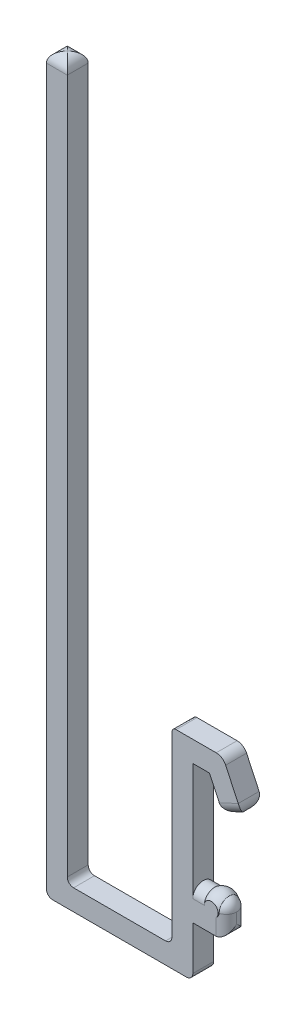
ISO-10303-21;
HEADER;
FILE_DESCRIPTION(('STEP AP214'),'2;1');
FILE_NAME('part.step','',(''),(''),'','','');
FILE_SCHEMA(('AUTOMOTIVE_DESIGN { 1 0 10303 214 1 1 1 1 }'));
ENDSEC;
DATA;
#1=APPLICATION_CONTEXT('core data for automotive mechanical design processes');
#2=APPLICATION_PROTOCOL_DEFINITION('international standard','automotive_design',2000,#1);
#3=PRODUCT_CONTEXT('',#1,'mechanical');
#4=PRODUCT('Part','Part','',(#3));
#5=PRODUCT_RELATED_PRODUCT_CATEGORY('part','',(#4));
#6=PRODUCT_DEFINITION_FORMATION('','',#4);
#7=PRODUCT_DEFINITION_CONTEXT('part definition',#1,'design');
#8=PRODUCT_DEFINITION('design','',#6,#7);
#9=PRODUCT_DEFINITION_SHAPE('','',#8);
#10=(LENGTH_UNIT() NAMED_UNIT(*) SI_UNIT(.MILLI.,.METRE.));
#11=(NAMED_UNIT(*) PLANE_ANGLE_UNIT() SI_UNIT($,.RADIAN.));
#12=(NAMED_UNIT(*) SI_UNIT($,.STERADIAN.) SOLID_ANGLE_UNIT());
#13=UNCERTAINTY_MEASURE_WITH_UNIT(LENGTH_MEASURE(1.E-05),#10,'distance_accuracy_value','');
#14=(GEOMETRIC_REPRESENTATION_CONTEXT(3) GLOBAL_UNCERTAINTY_ASSIGNED_CONTEXT((#13)) GLOBAL_UNIT_ASSIGNED_CONTEXT((#10,
#11,#12)) REPRESENTATION_CONTEXT('',''));
#15=CARTESIAN_POINT('',(0.,0.,0.));
#16=DIRECTION('',(0.,0.,1.));
#17=DIRECTION('',(1.,0.,0.));
#18=AXIS2_PLACEMENT_3D('',#15,#16,#17);
#19=CARTESIAN_POINT('',(13.5901699437495,0.,2.5));
#20=DIRECTION('',(-1.,0.,0.));
#21=DIRECTION('',(0.,0.,1.));
#22=AXIS2_PLACEMENT_3D('',#19,#20,#21);
#23=CYLINDRICAL_SURFACE('',#22,2.5);
#24=CARTESIAN_POINT('',(2.7416876048223,0.,2.5));
#25=DIRECTION('',(1.,0.,0.));
#26=DIRECTION('',(0.,0.,-1.));
#27=AXIS2_PLACEMENT_3D('',#24,#25,#26);
#28=CIRCLE('',#27,2.5);
#29=CARTESIAN_POINT('',(2.7416876048223,0.,0.));
#30=VERTEX_POINT('',#29);
#31=CARTESIAN_POINT('',(2.7416876048223,0.,5.));
#32=VERTEX_POINT('',#31);
#33=EDGE_CURVE('E236',#30,#32,#28,.T.);
#34=ORIENTED_EDGE('',*,*,#33,.F.);
#35=DIRECTION('',(-1.,0.,0.));
#36=VECTOR('',#35,1.);
#37=CARTESIAN_POINT('',(0.,0.,0.));
#38=LINE('',#37,#36);
#39=CARTESIAN_POINT('',(0.,0.,0.));
#40=VERTEX_POINT('',#39);
#41=EDGE_CURVE('E311',#30,#40,#38,.T.);
#42=ORIENTED_EDGE('',*,*,#41,.T.);
#43=CARTESIAN_POINT('',(0.,0.,2.5));
#44=DIRECTION('',(1.,0.,0.));
#45=DIRECTION('',(0.,0.,-1.));
#46=AXIS2_PLACEMENT_3D('',#43,#44,#45);
#47=CIRCLE('',#46,2.5);
#48=CARTESIAN_POINT('',(0.,0.,5.));
#49=VERTEX_POINT('',#48);
#50=EDGE_CURVE('E441',#40,#49,#47,.T.);
#51=ORIENTED_EDGE('',*,*,#50,.T.);
#52=DIRECTION('',(-1.,0.,0.));
#53=VECTOR('',#52,1.);
#54=CARTESIAN_POINT('',(0.,0.,5.));
#55=LINE('',#54,#53);
#56=EDGE_CURVE('E313',#32,#49,#55,.T.);
#57=ORIENTED_EDGE('',*,*,#56,.F.);
#58=EDGE_LOOP('',(#34,#42,#51,#57));
#59=FACE_BOUND('',#58,.T.);
#60=ADVANCED_FACE('F39',(#59),#23,.T.);
#61=CARTESIAN_POINT('',(5.5,0.,2.5));
#62=DIRECTION('',(0.,-1.,0.));
#63=DIRECTION('',(0.,0.,-1.));
#64=AXIS2_PLACEMENT_3D('',#61,#62,#63);
#65=CYLINDRICAL_SURFACE('',#64,2.5);
#66=DIRECTION('',(0.,1.,0.));
#67=VECTOR('',#66,1.);
#68=CARTESIAN_POINT('',(5.5,-5.,0.));
#69=LINE('',#68,#67);
#70=CARTESIAN_POINT('',(5.5,-1.24096736459909,0.));
#71=VERTEX_POINT('',#70);
#72=CARTESIAN_POINT('',(5.5,-5.,0.));
#73=VERTEX_POINT('',#72);
#74=EDGE_CURVE('E227',#71,#73,#69,.F.);
#75=ORIENTED_EDGE('',*,*,#74,.F.);
#76=CARTESIAN_POINT('',(5.4998,-1.24114463299005,8.00000016901504E-09));
#77=CARTESIAN_POINT('',(5.5363929673262,-1.2087029649529,-9.26164938524013E-06));
#78=CARTESIAN_POINT('',(5.57236876038989,-1.17555626849876,0.00079770122016531));
#79=CARTESIAN_POINT('',(5.6428030561148,-1.10769667819631,0.00383433659862395));
#80=CARTESIAN_POINT('',(5.67726031215857,-1.07298254322827,0.0060651555671746));
#81=CARTESIAN_POINT('',(5.74519128912905,-1.00095424317269,0.0118132669352872));
#82=CARTESIAN_POINT('',(5.77861573042543,-0.963595826296857,0.0153626740978217));
#83=CARTESIAN_POINT('',(5.84305795009588,-0.886981329738944,0.0234356736079334));
#84=CARTESIAN_POINT('',(5.8740762229525,-0.847725642663384,0.0279590650703918));
#85=CARTESIAN_POINT('',(5.96325201148396,-0.726269508254624,0.042561851108955));
#86=CARTESIAN_POINT('',(6.01705538420124,-0.640865596374251,0.0536260746175859));
#87=CARTESIAN_POINT('',(6.10655009460944,-0.461922147892546,0.074258393974845));
#88=CARTESIAN_POINT('',(6.14249859084772,-0.368522297372846,0.0838462716282918));
#89=CARTESIAN_POINT('',(6.17730370336194,-0.227795718404401,0.0934686773099391));
#90=CARTESIAN_POINT('',(6.18570287472368,-0.1829602446012,0.0958641595546958));
#91=CARTESIAN_POINT('',(6.19710907659667,-0.0920455434275466,0.0991560697495525));
#92=CARTESIAN_POINT('',(6.20005395659277,-0.0459579806521387,0.100035211650277));
#93=CARTESIAN_POINT('',(6.19999998181818,0.000200000000000188,0.0999999946969703));
#94=B_SPLINE_CURVE_WITH_KNOTS('',3,(#76,#77,#78,#79,#80,#81,#82,#83,#84,#85,#86,#87,#88,#89,#90,
#91,#92,#93),.UNSPECIFIED.,.F.,.F.,(4,2,2,2,2,2,2,2,4),(0.,0.146701218214616,0.29352070649968,
0.444179394748281,0.594807039223552,0.898088830284032,1.196865790681,1.3335683412279,
1.47181922641049),.UNSPECIFIED.);
#95=CARTESIAN_POINT('',(6.2,0.,0.100000000000001));
#96=VERTEX_POINT('',#95);
#97=EDGE_CURVE('E272',#71,#96,#94,.T.);
#98=ORIENTED_EDGE('',*,*,#97,.T.);
#99=CARTESIAN_POINT('',(5.5,0.,2.5));
#100=DIRECTION('',(0.,1.,0.));
#101=DIRECTION('',(0.,0.,1.));
#102=AXIS2_PLACEMENT_3D('',#99,#100,#101);
#103=CIRCLE('',#102,2.5);
#104=CARTESIAN_POINT('',(8.,0.,2.5));
#105=VERTEX_POINT('',#104);
#106=EDGE_CURVE('E472',#105,#96,#103,.T.);
#107=ORIENTED_EDGE('',*,*,#106,.F.);
#108=DIRECTION('',(0.,1.,0.));
#109=VECTOR('',#108,1.);
#110=CARTESIAN_POINT('',(8.,0.,2.5));
#111=LINE('',#110,#109);
#112=CARTESIAN_POINT('',(8.,-2.5,2.5));
#113=VERTEX_POINT('',#112);
#114=EDGE_CURVE('E470',#113,#105,#111,.T.);
#115=ORIENTED_EDGE('',*,*,#114,.F.);
#116=CARTESIAN_POINT('',(5.5,-2.5,2.5));
#117=DIRECTION('',(0.,0.707106781186547,-0.707106781186547));
#118=DIRECTION('',(0.,-0.707106781186547,-0.707106781186547));
#119=AXIS2_PLACEMENT_3D('',#116,#117,#118);
#120=ELLIPSE('',#119,3.53553390593274,2.5);
#121=EDGE_CURVE('E258',#73,#113,#120,.F.);
#122=ORIENTED_EDGE('',*,*,#121,.F.);
#123=EDGE_LOOP('',(#75,#98,#107,#115,#122));
#124=FACE_BOUND('',#123,.T.);
#125=ADVANCED_FACE('F284',(#124),#65,.T.);
#126=CARTESIAN_POINT('',(5.5,0.,2.5));
#127=DIRECTION('',(-1.,0.,0.));
#128=DIRECTION('',(0.,0.,1.));
#129=AXIS2_PLACEMENT_3D('',#126,#127,#128);
#130=SPHERICAL_SURFACE('',#129,2.5);
#131=ORIENTED_EDGE('',*,*,#106,.T.);
#132=CARTESIAN_POINT('',(6.2,0.,2.5));
#133=DIRECTION('',(-1.,0.,0.));
#134=DIRECTION('',(0.,0.,1.));
#135=AXIS2_PLACEMENT_3D('',#132,#133,#134);
#136=CIRCLE('',#135,2.4);
#137=CARTESIAN_POINT('',(6.2,0.,4.9));
#138=VERTEX_POINT('',#137);
#139=EDGE_CURVE('E282',#96,#138,#136,.F.);
#140=ORIENTED_EDGE('',*,*,#139,.T.);
#141=CARTESIAN_POINT('',(5.5,0.,2.5));
#142=DIRECTION('',(0.,-1.,0.));
#143=DIRECTION('',(0.,0.,-1.));
#144=AXIS2_PLACEMENT_3D('',#141,#142,#143);
#145=CIRCLE('',#144,2.5);
#146=EDGE_CURVE('E245',#105,#138,#145,.T.);
#147=ORIENTED_EDGE('',*,*,#146,.F.);
#148=EDGE_LOOP('',(#131,#140,#147));
#149=FACE_BOUND('',#148,.T.);
#150=ADVANCED_FACE('F289',(#149),#130,.T.);
#151=CARTESIAN_POINT('',(5.5,0.,2.5));
#152=DIRECTION('',(0.,1.,0.));
#153=DIRECTION('',(0.,0.,1.));
#154=AXIS2_PLACEMENT_3D('',#151,#152,#153);
#155=CYLINDRICAL_SURFACE('',#154,2.5);
#156=ORIENTED_EDGE('',*,*,#146,.T.);
#157=CARTESIAN_POINT('',(6.19999998181818,0.0002,4.90000000530303));
#158=CARTESIAN_POINT('',(6.20002060593483,-0.0340215820751625,4.8999881731683));
#159=CARTESIAN_POINT('',(6.1984143593459,-0.0682209096207422,4.90046286433432));
#160=CARTESIAN_POINT('',(6.19208379810463,-0.136249463080852,4.90229830533756));
#161=CARTESIAN_POINT('',(6.18736474729119,-0.170079215952131,4.90365755930238));
#162=CARTESIAN_POINT('',(6.1689482938362,-0.269536910764676,4.90887369332737));
#163=CARTESIAN_POINT('',(6.15098131886339,-0.334336983187606,4.91387497360715));
#164=CARTESIAN_POINT('',(6.09808868579219,-0.480851170246759,4.92759913373652));
#165=CARTESIAN_POINT('',(6.05953499991633,-0.561148858343043,4.9370045157109));
#166=CARTESIAN_POINT('',(5.97007827325949,-0.715449277029459,4.95583685420229));
#167=CARTESIAN_POINT('',(5.91904380010561,-0.789372868652353,4.96526290588241));
#168=CARTESIAN_POINT('',(5.80922506209963,-0.929818254648964,4.98141526656959));
#169=CARTESIAN_POINT('',(5.75055545651682,-0.996426935956446,4.98817650123594));
#170=CARTESIAN_POINT('',(5.65870838300495,-1.09170672728009,4.99514321976577));
#171=CARTESIAN_POINT('',(5.62774086496115,-1.12244386881611,4.99693401300135));
#172=CARTESIAN_POINT('',(5.56461568283012,-1.1826876244331,4.99936451304459));
#173=CARTESIAN_POINT('',(5.5324586096933,-1.21219483443042,5.00000478377816));
#174=CARTESIAN_POINT('',(5.4998,-1.24114463299005,4.999999992));
#175=B_SPLINE_CURVE_WITH_KNOTS('',3,(#157,#158,#159,#160,#161,#162,#163,#164,#165,#166,#167,
#168,#169,#170,#171,#172,#173,#174),.UNSPECIFIED.,.F.,.F.,(4,2,2,2,2,2,2,2,4),(0.,
0.102583403755103,0.204993779301411,0.406260766109181,0.673486519863846,0.943657669752398,
1.21015973265302,1.34112701736425,1.47203009124063),.UNSPECIFIED.);
#176=CARTESIAN_POINT('',(5.5,-1.24096736459909,5.));
#177=VERTEX_POINT('',#176);
#178=EDGE_CURVE('E233',#138,#177,#175,.T.);
#179=ORIENTED_EDGE('',*,*,#178,.T.);
#180=DIRECTION('',(0.,1.,0.));
#181=VECTOR('',#180,1.);
#182=CARTESIAN_POINT('',(5.5,0.,5.));
#183=LINE('',#182,#181);
#184=CARTESIAN_POINT('',(5.5,-5.,5.));
#185=VERTEX_POINT('',#184);
#186=EDGE_CURVE('E215',#185,#177,#183,.T.);
#187=ORIENTED_EDGE('',*,*,#186,.F.);
#188=CARTESIAN_POINT('',(5.5,-2.5,2.5));
#189=DIRECTION('',(0.,-0.707106781186547,-0.707106781186547));
#190=DIRECTION('',(0.,0.707106781186547,-0.707106781186547));
#191=AXIS2_PLACEMENT_3D('',#188,#189,#190);
#192=ELLIPSE('',#191,3.53553390593274,2.5);
#193=EDGE_CURVE('E467',#185,#113,#192,.F.);
#194=ORIENTED_EDGE('',*,*,#193,.T.);
#195=ORIENTED_EDGE('',*,*,#114,.T.);
#196=EDGE_LOOP('',(#156,#179,#187,#194,#195));
#197=FACE_BOUND('',#196,.T.);
#198=ADVANCED_FACE('F242',(#197),#155,.T.);
#199=CARTESIAN_POINT('',(0.,0.,5.));
#200=DIRECTION('',(-1.,0.,0.));
#201=DIRECTION('',(0.,0.,1.));
#202=AXIS2_PLACEMENT_3D('',#199,#200,#201);
#203=PLANE('',#202);
#204=ORIENTED_EDGE('',*,*,#50,.F.);
#205=DIRECTION('',(0.,1.,0.));
#206=VECTOR('',#205,1.);
#207=CARTESIAN_POINT('',(0.,0.,0.));
#208=LINE('',#207,#206);
#209=CARTESIAN_POINT('',(0.,28.,0.));
#210=VERTEX_POINT('',#209);
#211=EDGE_CURVE('E319',#40,#210,#208,.T.);
#212=ORIENTED_EDGE('',*,*,#211,.T.);
#213=DIRECTION('',(0.,0.,-1.));
#214=VECTOR('',#213,1.);
#215=CARTESIAN_POINT('',(0.,28.,5.));
#216=LINE('',#215,#214);
#217=CARTESIAN_POINT('',(0.,28.,5.));
#218=VERTEX_POINT('',#217);
#219=EDGE_CURVE('E380',#218,#210,#216,.T.);
#220=ORIENTED_EDGE('',*,*,#219,.F.);
#221=DIRECTION('',(0.,1.,0.));
#222=VECTOR('',#221,1.);
#223=CARTESIAN_POINT('',(0.,0.,5.));
#224=LINE('',#223,#222);
#225=EDGE_CURVE('E485',#49,#218,#224,.T.);
#226=ORIENTED_EDGE('',*,*,#225,.F.);
#227=EDGE_LOOP('',(#204,#212,#220,#226));
#228=FACE_BOUND('',#227,.T.);
#229=ADVANCED_FACE('F677',(#228),#203,.F.);
#230=CARTESIAN_POINT('',(0.,28.,5.));
#231=DIRECTION('',(0.,1.,0.));
#232=DIRECTION('',(0.,0.,1.));
#233=AXIS2_PLACEMENT_3D('',#230,#231,#232);
#234=PLANE('',#233);
#235=DIRECTION('',(1.,0.,0.));
#236=VECTOR('',#235,1.);
#237=CARTESIAN_POINT('',(0.,28.,0.));
#238=LINE('',#237,#236);
#239=CARTESIAN_POINT('',(4.,28.,0.));
#240=VERTEX_POINT('',#239);
#241=EDGE_CURVE('E326',#210,#240,#238,.T.);
#242=ORIENTED_EDGE('',*,*,#241,.T.);
#243=DIRECTION('',(0.,0.,-1.));
#244=VECTOR('',#243,1.);
#245=CARTESIAN_POINT('',(4.,28.,5.));
#246=LINE('',#245,#244);
#247=CARTESIAN_POINT('',(4.,28.,5.));
#248=VERTEX_POINT('',#247);
#249=EDGE_CURVE('E376',#248,#240,#246,.T.);
#250=ORIENTED_EDGE('',*,*,#249,.F.);
#251=DIRECTION('',(1.,0.,0.));
#252=VECTOR('',#251,1.);
#253=CARTESIAN_POINT('',(0.,28.,5.));
#254=LINE('',#253,#252);
#255=EDGE_CURVE('E488',#218,#248,#254,.T.);
#256=ORIENTED_EDGE('',*,*,#255,.F.);
#257=ORIENTED_EDGE('',*,*,#219,.T.);
#258=EDGE_LOOP('',(#242,#250,#256,#257));
#259=FACE_BOUND('',#258,.T.);
#260=ADVANCED_FACE('F673',(#259),#234,.F.);
#261=CARTESIAN_POINT('',(4.,28.,5.));
#262=DIRECTION('',(0.906307787036651,0.422618261740697,0.));
#263=DIRECTION('',(-0.422618261740697,0.906307787036651,0.));
#264=AXIS2_PLACEMENT_3D('',#261,#262,#263);
#265=PLANE('',#264);
#266=DIRECTION('',(0.422618261740697,-0.906307787036651,0.));
#267=VECTOR('',#266,1.);
#268=CARTESIAN_POINT('',(4.,28.,0.));
#269=LINE('',#268,#267);
#270=CARTESIAN_POINT('',(6.32440043957384,23.0153071712984,0.));
#271=VERTEX_POINT('',#270);
#272=EDGE_CURVE('E336',#240,#271,#269,.T.);
#273=ORIENTED_EDGE('',*,*,#272,.T.);
#274=DIRECTION('',(0.,0.,-1.));
#275=VECTOR('',#274,1.);
#276=CARTESIAN_POINT('',(6.32440043957383,23.0153071712984,5.));
#277=LINE('',#276,#275);
#278=CARTESIAN_POINT('',(6.32440043957384,23.0153071712984,5.));
#279=VERTEX_POINT('',#278);
#280=EDGE_CURVE('E384',#271,#279,#277,.F.);
#281=ORIENTED_EDGE('',*,*,#280,.T.);
#282=DIRECTION('',(0.422618261740697,-0.906307787036651,0.));
#283=VECTOR('',#282,1.);
#284=CARTESIAN_POINT('',(4.,28.,5.));
#285=LINE('',#284,#283);
#286=EDGE_CURVE('E491',#248,#279,#285,.T.);
#287=ORIENTED_EDGE('',*,*,#286,.F.);
#288=ORIENTED_EDGE('',*,*,#249,.T.);
#289=EDGE_LOOP('',(#273,#281,#287,#288));
#290=FACE_BOUND('',#289,.T.);
#291=ADVANCED_FACE('F668',(#290),#265,.F.);
#292=CARTESIAN_POINT('',(11.9124850291088,22.8626290124103,5.));
#293=DIRECTION('',(-0.906307787036651,-0.422618261740697,0.));
#294=DIRECTION('',(0.422618261740697,-0.906307787036651,0.));
#295=AXIS2_PLACEMENT_3D('',#292,#293,#294);
#296=PLANE('',#295);
#297=DIRECTION('',(-0.422618261740697,0.906307787036651,0.));
#298=VECTOR('',#297,1.);
#299=CARTESIAN_POINT('',(11.9124850291088,22.8626290124103,5.));
#300=LINE('',#299,#298);
#301=CARTESIAN_POINT('',(10.8559393747571,25.1283984800019,5.));
#302=VERTEX_POINT('',#301);
#303=CARTESIAN_POINT('',(7.85844511961037,31.5565456543517,5.));
#304=VERTEX_POINT('',#303);
#305=EDGE_CURVE('E495',#302,#304,#300,.T.);
#306=ORIENTED_EDGE('',*,*,#305,.F.);
#307=DIRECTION('',(0.,0.,-1.));
#308=VECTOR('',#307,1.);
#309=CARTESIAN_POINT('',(10.8559393747571,25.1283984800019,5.));
#310=LINE('',#309,#308);
#311=CARTESIAN_POINT('',(10.8559393747571,25.1283984800019,0.));
#312=VERTEX_POINT('',#311);
#313=EDGE_CURVE('E400',#302,#312,#310,.T.);
#314=ORIENTED_EDGE('',*,*,#313,.T.);
#315=DIRECTION('',(-0.422618261740697,0.906307787036651,0.));
#316=VECTOR('',#315,1.);
#317=CARTESIAN_POINT('',(11.9124850291088,22.8626290124103,0.));
#318=LINE('',#317,#316);
#319=CARTESIAN_POINT('',(7.85844511961037,31.5565456543517,0.));
#320=VERTEX_POINT('',#319);
#321=EDGE_CURVE('E340',#312,#320,#318,.T.);
#322=ORIENTED_EDGE('',*,*,#321,.T.);
#323=DIRECTION('',(0.,0.,-1.));
#324=VECTOR('',#323,1.);
#325=CARTESIAN_POINT('',(7.85844511961037,31.5565456543517,5.));
#326=LINE('',#325,#324);
#327=EDGE_CURVE('E397',#320,#304,#326,.F.);
#328=ORIENTED_EDGE('',*,*,#327,.T.);
#329=EDGE_LOOP('',(#306,#314,#322,#328));
#330=FACE_BOUND('',#329,.T.);
#331=ADVANCED_FACE('F654',(#330),#296,.F.);
#332=CARTESIAN_POINT('',(-5.,33.,5.));
#333=DIRECTION('',(0.,-1.,0.));
#334=DIRECTION('',(0.,0.,-1.));
#335=AXIS2_PLACEMENT_3D('',#332,#333,#334);
#336=PLANE('',#335);
#337=DIRECTION('',(-1.,0.,0.));
#338=VECTOR('',#337,1.);
#339=CARTESIAN_POINT('',(-5.,33.,0.));
#340=LINE('',#339,#338);
#341=CARTESIAN_POINT('',(5.59267565201873,33.,0.));
#342=VERTEX_POINT('',#341);
#343=CARTESIAN_POINT('',(-4.,33.,0.));
#344=VERTEX_POINT('',#343);
#345=EDGE_CURVE('E344',#342,#344,#340,.T.);
#346=ORIENTED_EDGE('',*,*,#345,.T.);
#347=DIRECTION('',(0.,0.,-1.));
#348=VECTOR('',#347,1.);
#349=CARTESIAN_POINT('',(-4.,33.,5.));
#350=LINE('',#349,#348);
#351=CARTESIAN_POINT('',(-4.,33.,5.));
#352=VERTEX_POINT('',#351);
#353=EDGE_CURVE('E458',#344,#352,#350,.F.);
#354=ORIENTED_EDGE('',*,*,#353,.T.);
#355=DIRECTION('',(-1.,0.,0.));
#356=VECTOR('',#355,1.);
#357=CARTESIAN_POINT('',(-5.,33.,5.));
#358=LINE('',#357,#356);
#359=CARTESIAN_POINT('',(5.59267565201873,33.,5.));
#360=VERTEX_POINT('',#359);
#361=EDGE_CURVE('E499',#360,#352,#358,.T.);
#362=ORIENTED_EDGE('',*,*,#361,.F.);
#363=DIRECTION('',(0.,0.,-1.));
#364=VECTOR('',#363,1.);
#365=CARTESIAN_POINT('',(5.59267565201874,33.,5.));
#366=LINE('',#365,#364);
#367=EDGE_CURVE('E420',#360,#342,#366,.T.);
#368=ORIENTED_EDGE('',*,*,#367,.T.);
#369=EDGE_LOOP('',(#346,#354,#362,#368));
#370=FACE_BOUND('',#369,.T.);
#371=ADVANCED_FACE('F646',(#370),#336,.F.);
#372=CARTESIAN_POINT('',(-5.,33.,5.));
#373=DIRECTION('',(1.,0.,0.));
#374=DIRECTION('',(0.,1.,0.));
#375=AXIS2_PLACEMENT_3D('',#372,#373,#374);
#376=PLANE('',#375);
#377=DIRECTION('',(0.,-1.,0.));
#378=VECTOR('',#377,1.);
#379=CARTESIAN_POINT('',(-5.,33.,0.));
#380=LINE('',#379,#378);
#381=CARTESIAN_POINT('',(-5.,32.,0.));
#382=VERTEX_POINT('',#381);
#383=CARTESIAN_POINT('',(-4.99999999999999,-10.5,0.));
#384=VERTEX_POINT('',#383);
#385=EDGE_CURVE('E348',#382,#384,#380,.T.);
#386=ORIENTED_EDGE('',*,*,#385,.T.);
#387=DIRECTION('',(0.,0.,-1.));
#388=VECTOR('',#387,1.);
#389=CARTESIAN_POINT('',(-4.99999999999999,-10.5,5.));
#390=LINE('',#389,#388);
#391=CARTESIAN_POINT('',(-4.99999999999999,-10.5,5.));
#392=VERTEX_POINT('',#391);
#393=EDGE_CURVE('E572',#384,#392,#390,.F.);
#394=ORIENTED_EDGE('',*,*,#393,.T.);
#395=DIRECTION('',(0.,-1.,0.));
#396=VECTOR('',#395,1.);
#397=CARTESIAN_POINT('',(-5.,33.,5.));
#398=LINE('',#397,#396);
#399=CARTESIAN_POINT('',(-5.,32.,5.));
#400=VERTEX_POINT('',#399);
#401=EDGE_CURVE('E503',#400,#392,#398,.T.);
#402=ORIENTED_EDGE('',*,*,#401,.F.);
#403=DIRECTION('',(0.,0.,-1.));
#404=VECTOR('',#403,1.);
#405=CARTESIAN_POINT('',(-5.,32.,5.));
#406=LINE('',#405,#404);
#407=EDGE_CURVE('E424',#400,#382,#406,.T.);
#408=ORIENTED_EDGE('',*,*,#407,.T.);
#409=EDGE_LOOP('',(#386,#394,#402,#408));
#410=FACE_BOUND('',#409,.T.);
#411=ADVANCED_FACE('F641',(#410),#376,.F.);
#412=CARTESIAN_POINT('',(-30.,-12.,5.));
#413=DIRECTION('',(0.,-1.,0.));
#414=DIRECTION('',(0.,0.,-1.));
#415=AXIS2_PLACEMENT_3D('',#412,#413,#414);
#416=PLANE('',#415);
#417=DIRECTION('',(-1.,0.,0.));
#418=VECTOR('',#417,1.);
#419=CARTESIAN_POINT('',(-30.,-12.,5.));
#420=LINE('',#419,#418);
#421=CARTESIAN_POINT('',(-6.5,-12.,5.));
#422=VERTEX_POINT('',#421);
#423=CARTESIAN_POINT('',(-28.5,-12.,5.));
#424=VERTEX_POINT('',#423);
#425=EDGE_CURVE('E507',#422,#424,#420,.T.);
#426=ORIENTED_EDGE('',*,*,#425,.F.);
#427=DIRECTION('',(0.,0.,-1.));
#428=VECTOR('',#427,1.);
#429=CARTESIAN_POINT('',(-6.5,-12.,0.));
#430=LINE('',#429,#428);
#431=CARTESIAN_POINT('',(-6.5,-12.,0.));
#432=VERTEX_POINT('',#431);
#433=EDGE_CURVE('E575',#422,#432,#430,.T.);
#434=ORIENTED_EDGE('',*,*,#433,.T.);
#435=DIRECTION('',(-1.,0.,0.));
#436=VECTOR('',#435,1.);
#437=CARTESIAN_POINT('',(-30.,-12.,0.));
#438=LINE('',#437,#436);
#439=CARTESIAN_POINT('',(-28.5,-12.,0.));
#440=VERTEX_POINT('',#439);
#441=EDGE_CURVE('E352',#432,#440,#438,.T.);
#442=ORIENTED_EDGE('',*,*,#441,.T.);
#443=DIRECTION('',(0.,0.,-1.));
#444=VECTOR('',#443,1.);
#445=CARTESIAN_POINT('',(-28.5,-12.,5.));
#446=LINE('',#445,#444);
#447=EDGE_CURVE('E579',#440,#424,#446,.F.);
#448=ORIENTED_EDGE('',*,*,#447,.T.);
#449=EDGE_LOOP('',(#426,#434,#442,#448));
#450=FACE_BOUND('',#449,.T.);
#451=ADVANCED_FACE('F585',(#450),#416,.F.);
#452=CARTESIAN_POINT('',(-30.,-12.,5.));
#453=DIRECTION('',(-1.,0.,0.));
#454=DIRECTION('',(0.,-1.,0.));
#455=AXIS2_PLACEMENT_3D('',#452,#453,#454);
#456=PLANE('',#455);
#457=DIRECTION('',(0.,1.,0.));
#458=VECTOR('',#457,1.);
#459=CARTESIAN_POINT('',(-30.,-12.,5.));
#460=LINE('',#459,#458);
#461=CARTESIAN_POINT('',(-30.,-10.5,5.));
#462=VERTEX_POINT('',#461);
#463=CARTESIAN_POINT('',(-30.,155.5,5.));
#464=VERTEX_POINT('',#463);
#465=EDGE_CURVE('E511',#462,#464,#460,.T.);
#466=ORIENTED_EDGE('',*,*,#465,.F.);
#467=DIRECTION('',(0.,0.,-1.));
#468=VECTOR('',#467,1.);
#469=CARTESIAN_POINT('',(-30.,-10.5,0.));
#470=LINE('',#469,#468);
#471=CARTESIAN_POINT('',(-30.,-10.5,0.));
#472=VERTEX_POINT('',#471);
#473=EDGE_CURVE('E568',#462,#472,#470,.T.);
#474=ORIENTED_EDGE('',*,*,#473,.T.);
#475=DIRECTION('',(0.,1.,0.));
#476=VECTOR('',#475,1.);
#477=CARTESIAN_POINT('',(-30.,-12.,0.));
#478=LINE('',#477,#476);
#479=CARTESIAN_POINT('',(-30.,155.5,0.));
#480=VERTEX_POINT('',#479);
#481=EDGE_CURVE('E356',#472,#480,#478,.T.);
#482=ORIENTED_EDGE('',*,*,#481,.T.);
#483=DIRECTION('',(0.,0.,-1.));
#484=VECTOR('',#483,1.);
#485=CARTESIAN_POINT('',(-30.,155.5,5.));
#486=LINE('',#485,#484);
#487=EDGE_CURVE('E413',#480,#464,#486,.F.);
#488=ORIENTED_EDGE('',*,*,#487,.T.);
#489=EDGE_LOOP('',(#466,#474,#482,#488));
#490=FACE_BOUND('',#489,.T.);
#491=ADVANCED_FACE('F594',(#490),#456,.F.);
#492=CARTESIAN_POINT('',(-35.,158.,5.));
#493=DIRECTION('',(1.,0.,0.));
#494=DIRECTION('',(0.,1.,0.));
#495=AXIS2_PLACEMENT_3D('',#492,#493,#494);
#496=PLANE('',#495);
#497=DIRECTION('',(0.,-1.,0.));
#498=VECTOR('',#497,1.);
#499=CARTESIAN_POINT('',(-35.,158.,0.));
#500=LINE('',#499,#498);
#501=CARTESIAN_POINT('',(-35.,155.5,0.));
#502=VERTEX_POINT('',#501);
#503=CARTESIAN_POINT('',(-35.,-15.5,0.));
#504=VERTEX_POINT('',#503);
#505=EDGE_CURVE('E359',#502,#504,#500,.T.);
#506=ORIENTED_EDGE('',*,*,#505,.T.);
#507=DIRECTION('',(0.,0.,-1.));
#508=VECTOR('',#507,1.);
#509=CARTESIAN_POINT('',(-35.,-15.5,5.));
#510=LINE('',#509,#508);
#511=CARTESIAN_POINT('',(-35.,-15.5,5.));
#512=VERTEX_POINT('',#511);
#513=EDGE_CURVE('E11',#504,#512,#510,.F.);
#514=ORIENTED_EDGE('',*,*,#513,.T.);
#515=DIRECTION('',(0.,-1.,0.));
#516=VECTOR('',#515,1.);
#517=CARTESIAN_POINT('',(-35.,158.,5.));
#518=LINE('',#517,#516);
#519=CARTESIAN_POINT('',(-35.,155.5,5.));
#520=VERTEX_POINT('',#519);
#521=EDGE_CURVE('E514',#520,#512,#518,.T.);
#522=ORIENTED_EDGE('',*,*,#521,.F.);
#523=DIRECTION('',(0.,0.,-1.));
#524=VECTOR('',#523,1.);
#525=CARTESIAN_POINT('',(-35.,155.5,5.));
#526=LINE('',#525,#524);
#527=EDGE_CURVE('E417',#520,#502,#526,.T.);
#528=ORIENTED_EDGE('',*,*,#527,.T.);
#529=EDGE_LOOP('',(#506,#514,#522,#528));
#530=FACE_BOUND('',#529,.T.);
#531=ADVANCED_FACE('F611',(#530),#496,.F.);
#532=CARTESIAN_POINT('',(-35.,-17.,5.));
#533=DIRECTION('',(0.,1.,0.));
#534=DIRECTION('',(0.,0.,1.));
#535=AXIS2_PLACEMENT_3D('',#532,#533,#534);
#536=PLANE('',#535);
#537=DIRECTION('',(1.,0.,0.));
#538=VECTOR('',#537,1.);
#539=CARTESIAN_POINT('',(-35.,-17.,0.));
#540=LINE('',#539,#538);
#541=CARTESIAN_POINT('',(-33.5,-17.,0.));
#542=VERTEX_POINT('',#541);
#543=CARTESIAN_POINT('',(-1.5,-17.,0.));
#544=VERTEX_POINT('',#543);
#545=EDGE_CURVE('E362',#542,#544,#540,.T.);
#546=ORIENTED_EDGE('',*,*,#545,.T.);
#547=DIRECTION('',(0.,0.,-1.));
#548=VECTOR('',#547,1.);
#549=CARTESIAN_POINT('',(-1.5,-17.,5.));
#550=LINE('',#549,#548);
#551=CARTESIAN_POINT('',(-1.5,-17.,5.));
#552=VERTEX_POINT('',#551);
#553=EDGE_CURVE('E61',#544,#552,#550,.F.);
#554=ORIENTED_EDGE('',*,*,#553,.T.);
#555=DIRECTION('',(1.,0.,0.));
#556=VECTOR('',#555,1.);
#557=CARTESIAN_POINT('',(-35.,-17.,5.));
#558=LINE('',#557,#556);
#559=CARTESIAN_POINT('',(-33.5,-17.,5.));
#560=VERTEX_POINT('',#559);
#561=EDGE_CURVE('E517',#560,#552,#558,.T.);
#562=ORIENTED_EDGE('',*,*,#561,.F.);
#563=DIRECTION('',(0.,0.,-1.));
#564=VECTOR('',#563,1.);
#565=CARTESIAN_POINT('',(-33.5,-17.,5.));
#566=LINE('',#565,#564);
#567=EDGE_CURVE('E536',#560,#542,#566,.T.);
#568=ORIENTED_EDGE('',*,*,#567,.T.);
#569=EDGE_LOOP('',(#546,#554,#562,#568));
#570=FACE_BOUND('',#569,.T.);
#571=ADVANCED_FACE('F540',(#570),#536,.F.);
#572=CARTESIAN_POINT('',(0.,-5.,5.));
#573=DIRECTION('',(-1.,0.,0.));
#574=DIRECTION('',(0.,0.,1.));
#575=AXIS2_PLACEMENT_3D('',#572,#573,#574);
#576=PLANE('',#575);
#577=DIRECTION('',(0.,1.,0.));
#578=VECTOR('',#577,1.);
#579=CARTESIAN_POINT('',(0.,-5.,5.));
#580=LINE('',#579,#578);
#581=CARTESIAN_POINT('',(0.,-15.5,5.));
#582=VERTEX_POINT('',#581);
#583=CARTESIAN_POINT('',(0.,-5.,5.));
#584=VERTEX_POINT('',#583);
#585=EDGE_CURVE('E519',#582,#584,#580,.T.);
#586=ORIENTED_EDGE('',*,*,#585,.F.);
#587=DIRECTION('',(0.,0.,-1.));
#588=VECTOR('',#587,1.);
#589=CARTESIAN_POINT('',(0.,-15.5,5.));
#590=LINE('',#589,#588);
#591=CARTESIAN_POINT('',(0.,-15.5,0.));
#592=VERTEX_POINT('',#591);
#593=EDGE_CURVE('E553',#582,#592,#590,.T.);
#594=ORIENTED_EDGE('',*,*,#593,.T.);
#595=DIRECTION('',(0.,1.,0.));
#596=VECTOR('',#595,1.);
#597=CARTESIAN_POINT('',(0.,-5.,0.));
#598=LINE('',#597,#596);
#599=CARTESIAN_POINT('',(0.,-5.,0.));
#600=VERTEX_POINT('',#599);
#601=EDGE_CURVE('E365',#592,#600,#598,.T.);
#602=ORIENTED_EDGE('',*,*,#601,.T.);
#603=DIRECTION('',(0.,0.,-1.));
#604=VECTOR('',#603,1.);
#605=CARTESIAN_POINT('',(0.,-5.,5.));
#606=LINE('',#605,#604);
#607=EDGE_CURVE('E372',#584,#600,#606,.T.);
#608=ORIENTED_EDGE('',*,*,#607,.F.);
#609=EDGE_LOOP('',(#586,#594,#602,#608));
#610=FACE_BOUND('',#609,.T.);
#611=ADVANCED_FACE('F527',(#610),#576,.F.);
#612=CARTESIAN_POINT('',(8.,-5.,5.));
#613=DIRECTION('',(0.,1.,0.));
#614=DIRECTION('',(0.,0.,1.));
#615=AXIS2_PLACEMENT_3D('',#612,#613,#614);
#616=PLANE('',#615);
#617=DIRECTION('',(1.,0.,0.));
#618=VECTOR('',#617,1.);
#619=CARTESIAN_POINT('',(8.,-5.,0.));
#620=LINE('',#619,#618);
#621=EDGE_CURVE('E368',#600,#73,#620,.T.);
#622=ORIENTED_EDGE('',*,*,#621,.T.);
#623=DIRECTION('',(0.,0.,-1.));
#624=VECTOR('',#623,1.);
#625=CARTESIAN_POINT('',(5.5,-5.,5.));
#626=LINE('',#625,#624);
#627=EDGE_CURVE('E247',#73,#185,#626,.F.);
#628=ORIENTED_EDGE('',*,*,#627,.T.);
#629=DIRECTION('',(1.,0.,0.));
#630=VECTOR('',#629,1.);
#631=CARTESIAN_POINT('',(8.,-5.,5.));
#632=LINE('',#631,#630);
#633=EDGE_CURVE('E221',#584,#185,#632,.T.);
#634=ORIENTED_EDGE('',*,*,#633,.F.);
#635=ORIENTED_EDGE('',*,*,#607,.T.);
#636=EDGE_LOOP('',(#622,#628,#634,#635));
#637=FACE_BOUND('',#636,.T.);
#638=ADVANCED_FACE('F530',(#637),#616,.F.);
#639=CARTESIAN_POINT('',(0.,0.,5.));
#640=DIRECTION('',(0.,0.,-1.));
#641=DIRECTION('',(-1.,0.,0.));
#642=AXIS2_PLACEMENT_3D('',#639,#640,#641);
#643=PLANE('',#642);
#644=ORIENTED_EDGE('',*,*,#561,.T.);
#645=CARTESIAN_POINT('',(-1.5,-15.5,5.));
#646=DIRECTION('',(0.,0.,-1.));
#647=DIRECTION('',(-1.,0.,0.));
#648=AXIS2_PLACEMENT_3D('',#645,#646,#647);
#649=CIRCLE('',#648,1.5);
#650=EDGE_CURVE('E48',#552,#582,#649,.F.);
#651=ORIENTED_EDGE('',*,*,#650,.T.);
#652=ORIENTED_EDGE('',*,*,#585,.T.);
#653=ORIENTED_EDGE('',*,*,#633,.T.);
#654=ORIENTED_EDGE('',*,*,#186,.T.);
#655=CARTESIAN_POINT('',(4.4,0.,5.));
#656=DIRECTION('',(0.,0.,-1.));
#657=DIRECTION('',(-1.,0.,0.));
#658=AXIS2_PLACEMENT_3D('',#655,#656,#657);
#659=CIRCLE('',#658,1.6583123951777);
#660=EDGE_CURVE('E218',#32,#177,#659,.T.);
#661=ORIENTED_EDGE('',*,*,#660,.F.);
#662=ORIENTED_EDGE('',*,*,#56,.T.);
#663=ORIENTED_EDGE('',*,*,#225,.T.);
#664=ORIENTED_EDGE('',*,*,#255,.T.);
#665=ORIENTED_EDGE('',*,*,#286,.T.);
#666=DIRECTION('',(0.906307787036651,0.422618261740698,0.));
#667=VECTOR('',#666,1.);
#668=CARTESIAN_POINT('',(-7.68579698346491,16.4822448206721,5.));
#669=LINE('',#668,#667);
#670=EDGE_CURVE('E394',#279,#302,#669,.T.);
#671=ORIENTED_EDGE('',*,*,#670,.T.);
#672=ORIENTED_EDGE('',*,*,#305,.T.);
#673=CARTESIAN_POINT('',(5.59267565201874,30.5,5.));
#674=DIRECTION('',(0.,0.,-1.));
#675=DIRECTION('',(-1.,0.,0.));
#676=AXIS2_PLACEMENT_3D('',#673,#674,#675);
#677=CIRCLE('',#676,2.5);
#678=EDGE_CURVE('E388',#304,#360,#677,.F.);
#679=ORIENTED_EDGE('',*,*,#678,.T.);
#680=ORIENTED_EDGE('',*,*,#361,.T.);
#681=CARTESIAN_POINT('',(-4.,32.,5.));
#682=DIRECTION('',(0.,0.,-1.));
#683=DIRECTION('',(-1.,0.,0.));
#684=AXIS2_PLACEMENT_3D('',#681,#682,#683);
#685=CIRCLE('',#684,1.);
#686=EDGE_CURVE('E228',#352,#400,#685,.F.);
#687=ORIENTED_EDGE('',*,*,#686,.T.);
#688=ORIENTED_EDGE('',*,*,#401,.T.);
#689=CARTESIAN_POINT('',(-6.5,-10.5,5.));
#690=DIRECTION('',(0.,0.,-1.));
#691=DIRECTION('',(-1.,0.,0.));
#692=AXIS2_PLACEMENT_3D('',#689,#690,#691);
#693=CIRCLE('',#692,1.5);
#694=EDGE_CURVE('E562',#392,#422,#693,.T.);
#695=ORIENTED_EDGE('',*,*,#694,.T.);
#696=ORIENTED_EDGE('',*,*,#425,.T.);
#697=CARTESIAN_POINT('',(-28.5,-10.5,5.));
#698=DIRECTION('',(0.,0.,-1.));
#699=DIRECTION('',(-1.,0.,0.));
#700=AXIS2_PLACEMENT_3D('',#697,#698,#699);
#701=CIRCLE('',#700,1.5);
#702=EDGE_CURVE('E556',#424,#462,#701,.T.);
#703=ORIENTED_EDGE('',*,*,#702,.T.);
#704=ORIENTED_EDGE('',*,*,#465,.T.);
#705=DIRECTION('',(-1.,0.,0.));
#706=VECTOR('',#705,1.);
#707=CARTESIAN_POINT('',(0.,155.5,5.));
#708=LINE('',#707,#706);
#709=EDGE_CURVE('E391',#464,#520,#708,.T.);
#710=ORIENTED_EDGE('',*,*,#709,.T.);
#711=ORIENTED_EDGE('',*,*,#521,.T.);
#712=CARTESIAN_POINT('',(-33.5,-15.5,5.));
#713=DIRECTION('',(0.,0.,-1.));
#714=DIRECTION('',(-1.,0.,0.));
#715=AXIS2_PLACEMENT_3D('',#712,#713,#714);
#716=CIRCLE('',#715,1.5);
#717=EDGE_CURVE('E543',#512,#560,#716,.F.);
#718=ORIENTED_EDGE('',*,*,#717,.T.);
#719=EDGE_LOOP('',(#644,#651,#652,#653,#654,#661,#662,#663,#664,#665,#671,#672,#679,#680,#687,
#688,#695,#696,#703,#704,#710,#711,#718));
#720=FACE_BOUND('',#719,.T.);
#721=ADVANCED_FACE('F217',(#720),#643,.F.);
#722=CARTESIAN_POINT('',(0.,0.,0.));
#723=DIRECTION('',(0.,0.,-1.));
#724=DIRECTION('',(-1.,0.,0.));
#725=AXIS2_PLACEMENT_3D('',#722,#723,#724);
#726=PLANE('',#725);
#727=ORIENTED_EDGE('',*,*,#601,.F.);
#728=CARTESIAN_POINT('',(-1.5,-15.5,0.));
#729=DIRECTION('',(0.,0.,-1.));
#730=DIRECTION('',(-1.,0.,0.));
#731=AXIS2_PLACEMENT_3D('',#728,#729,#730);
#732=CIRCLE('',#731,1.5);
#733=EDGE_CURVE('E534',#592,#544,#732,.T.);
#734=ORIENTED_EDGE('',*,*,#733,.T.);
#735=ORIENTED_EDGE('',*,*,#545,.F.);
#736=CARTESIAN_POINT('',(-33.5,-15.5,0.));
#737=DIRECTION('',(0.,0.,-1.));
#738=DIRECTION('',(-1.,0.,0.));
#739=AXIS2_PLACEMENT_3D('',#736,#737,#738);
#740=CIRCLE('',#739,1.5);
#741=EDGE_CURVE('E537',#542,#504,#740,.T.);
#742=ORIENTED_EDGE('',*,*,#741,.T.);
#743=ORIENTED_EDGE('',*,*,#505,.F.);
#744=DIRECTION('',(-1.,0.,0.));
#745=VECTOR('',#744,1.);
#746=CARTESIAN_POINT('',(-30.,155.5,0.));
#747=LINE('',#746,#745);
#748=EDGE_CURVE('E406',#502,#480,#747,.F.);
#749=ORIENTED_EDGE('',*,*,#748,.T.);
#750=ORIENTED_EDGE('',*,*,#481,.F.);
#751=CARTESIAN_POINT('',(-28.5,-10.5,0.));
#752=DIRECTION('',(0.,0.,-1.));
#753=DIRECTION('',(-1.,0.,0.));
#754=AXIS2_PLACEMENT_3D('',#751,#752,#753);
#755=CIRCLE('',#754,1.5);
#756=EDGE_CURVE('E559',#472,#440,#755,.F.);
#757=ORIENTED_EDGE('',*,*,#756,.T.);
#758=ORIENTED_EDGE('',*,*,#441,.F.);
#759=CARTESIAN_POINT('',(-6.5,-10.5,0.));
#760=DIRECTION('',(0.,0.,-1.));
#761=DIRECTION('',(-1.,0.,0.));
#762=AXIS2_PLACEMENT_3D('',#759,#760,#761);
#763=CIRCLE('',#762,1.5);
#764=EDGE_CURVE('E565',#432,#384,#763,.F.);
#765=ORIENTED_EDGE('',*,*,#764,.T.);
#766=ORIENTED_EDGE('',*,*,#385,.F.);
#767=CARTESIAN_POINT('',(-4.,32.,0.));
#768=DIRECTION('',(0.,0.,-1.));
#769=DIRECTION('',(-1.,0.,0.));
#770=AXIS2_PLACEMENT_3D('',#767,#768,#769);
#771=CIRCLE('',#770,1.);
#772=EDGE_CURVE('E455',#382,#344,#771,.T.);
#773=ORIENTED_EDGE('',*,*,#772,.T.);
#774=ORIENTED_EDGE('',*,*,#345,.F.);
#775=CARTESIAN_POINT('',(5.59267565201874,30.5,0.));
#776=DIRECTION('',(0.,0.,-1.));
#777=DIRECTION('',(-1.,0.,0.));
#778=AXIS2_PLACEMENT_3D('',#775,#776,#777);
#779=CIRCLE('',#778,2.5);
#780=EDGE_CURVE('E403',#342,#320,#779,.T.);
#781=ORIENTED_EDGE('',*,*,#780,.T.);
#782=ORIENTED_EDGE('',*,*,#321,.F.);
#783=DIRECTION('',(0.906307787036651,0.422618261740698,0.));
#784=VECTOR('',#783,1.);
#785=CARTESIAN_POINT('',(6.32440043957383,23.0153071712984,0.));
#786=LINE('',#785,#784);
#787=EDGE_CURVE('E410',#312,#271,#786,.F.);
#788=ORIENTED_EDGE('',*,*,#787,.T.);
#789=ORIENTED_EDGE('',*,*,#272,.F.);
#790=ORIENTED_EDGE('',*,*,#241,.F.);
#791=ORIENTED_EDGE('',*,*,#211,.F.);
#792=ORIENTED_EDGE('',*,*,#41,.F.);
#793=CARTESIAN_POINT('',(4.4,0.,0.));
#794=DIRECTION('',(0.,0.,1.));
#795=DIRECTION('',(1.,0.,0.));
#796=AXIS2_PLACEMENT_3D('',#793,#794,#795);
#797=CIRCLE('',#796,1.6583123951777);
#798=EDGE_CURVE('E239',#71,#30,#797,.T.);
#799=ORIENTED_EDGE('',*,*,#798,.F.);
#800=ORIENTED_EDGE('',*,*,#74,.T.);
#801=ORIENTED_EDGE('',*,*,#621,.F.);
#802=EDGE_LOOP('',(#727,#734,#735,#742,#743,#749,#750,#757,#758,#765,#766,#773,#774,#781,#782,
#788,#789,#790,#791,#792,#799,#800,#801));
#803=FACE_BOUND('',#802,.T.);
#804=ADVANCED_FACE('F317',(#803),#726,.T.);
#805=CARTESIAN_POINT('',(8.59016990716546,24.0718528256502,5.));
#806=DIRECTION('',(0.,0.,-1.));
#807=DIRECTION('',(-1.,0.,0.));
#808=AXIS2_PLACEMENT_3D('',#805,#806,#807);
#809=CYLINDRICAL_SURFACE('',#808,2.5);
#810=CARTESIAN_POINT('',(8.59016990716546,24.0718528256502,2.5));
#811=DIRECTION('',(-0.640856382055789,-0.298836238730119,-0.707106781186547));
#812=DIRECTION('',(-0.640856382055789,-0.298836238730119,0.707106781186547));
#813=AXIS2_PLACEMENT_3D('',#810,#811,#812);
#814=ELLIPSE('',#813,3.53553390593274,2.5);
#815=CARTESIAN_POINT('',(9.64671556151721,21.8060833580585,2.5));
#816=VERTEX_POINT('',#815);
#817=EDGE_CURVE('E329',#312,#816,#814,.T.);
#818=ORIENTED_EDGE('',*,*,#817,.F.);
#819=ORIENTED_EDGE('',*,*,#313,.F.);
#820=CARTESIAN_POINT('',(8.59016990716546,24.0718528256502,2.5));
#821=DIRECTION('',(0.640856382055789,0.298836238730119,-0.707106781186547));
#822=DIRECTION('',(-0.640856382055789,-0.298836238730119,-0.707106781186547));
#823=AXIS2_PLACEMENT_3D('',#820,#821,#822);
#824=ELLIPSE('',#823,3.53553390593274,2.5);
#825=EDGE_CURVE('E322',#816,#302,#824,.F.);
#826=ORIENTED_EDGE('',*,*,#825,.F.);
#827=EDGE_LOOP('',(#818,#819,#826));
#828=FACE_BOUND('',#827,.T.);
#829=ADVANCED_FACE('F657',(#828),#809,.T.);
#830=CARTESIAN_POINT('',(-7.68579698346491,16.4822448206721,2.5));
#831=DIRECTION('',(0.906307787036651,0.422618261740698,0.));
#832=DIRECTION('',(-0.422618261740698,0.906307787036651,0.));
#833=AXIS2_PLACEMENT_3D('',#830,#831,#832);
#834=CYLINDRICAL_SURFACE('',#833,2.5);
#835=ORIENTED_EDGE('',*,*,#825,.T.);
#836=ORIENTED_EDGE('',*,*,#670,.F.);
#837=CARTESIAN_POINT('',(8.59016990716546,24.0718528256502,2.5));
#838=DIRECTION('',(0.640856382055789,0.298836238730119,0.707106781186547));
#839=DIRECTION('',(0.640856382055789,0.298836238730119,-0.707106781186547));
#840=AXIS2_PLACEMENT_3D('',#837,#838,#839);
#841=ELLIPSE('',#840,3.53553390593274,2.5);
#842=EDGE_CURVE('E429',#816,#279,#841,.F.);
#843=ORIENTED_EDGE('',*,*,#842,.F.);
#844=EDGE_LOOP('',(#835,#836,#843));
#845=FACE_BOUND('',#844,.T.);
#846=ADVANCED_FACE('F662',(#845),#834,.T.);
#847=CARTESIAN_POINT('',(6.32440043957383,23.0153071712984,2.5));
#848=DIRECTION('',(-0.906307787036651,-0.422618261740698,0.));
#849=DIRECTION('',(0.422618261740698,-0.906307787036651,0.));
#850=AXIS2_PLACEMENT_3D('',#847,#848,#849);
#851=CYLINDRICAL_SURFACE('',#850,2.5);
#852=ORIENTED_EDGE('',*,*,#787,.F.);
#853=ORIENTED_EDGE('',*,*,#817,.T.);
#854=CARTESIAN_POINT('',(8.59016990716546,24.0718528256502,2.5));
#855=DIRECTION('',(-0.640856382055789,-0.298836238730119,0.707106781186547));
#856=DIRECTION('',(-0.640856382055789,-0.298836238730119,-0.707106781186547));
#857=AXIS2_PLACEMENT_3D('',#854,#855,#856);
#858=ELLIPSE('',#857,3.53553390593274,2.5);
#859=EDGE_CURVE('E425',#271,#816,#858,.T.);
#860=ORIENTED_EDGE('',*,*,#859,.F.);
#861=EDGE_LOOP('',(#852,#853,#860));
#862=FACE_BOUND('',#861,.T.);
#863=ADVANCED_FACE('F621',(#862),#851,.T.);
#864=CARTESIAN_POINT('',(8.59016990716546,24.0718528256502,5.));
#865=DIRECTION('',(0.,0.,-1.));
#866=DIRECTION('',(-1.,0.,0.));
#867=AXIS2_PLACEMENT_3D('',#864,#865,#866);
#868=CYLINDRICAL_SURFACE('',#867,2.5);
#869=ORIENTED_EDGE('',*,*,#842,.T.);
#870=ORIENTED_EDGE('',*,*,#280,.F.);
#871=ORIENTED_EDGE('',*,*,#859,.T.);
#872=EDGE_LOOP('',(#869,#870,#871));
#873=FACE_BOUND('',#872,.T.);
#874=ADVANCED_FACE('F614',(#873),#868,.T.);
#875=CARTESIAN_POINT('',(-32.5,155.5,5.));
#876=DIRECTION('',(0.,0.,-1.));
#877=DIRECTION('',(-1.,0.,0.));
#878=AXIS2_PLACEMENT_3D('',#875,#876,#877);
#879=CYLINDRICAL_SURFACE('',#878,2.5);
#880=CARTESIAN_POINT('',(-32.5,155.5,2.5));
#881=DIRECTION('',(0.707106781186547,0.,-0.707106781186547));
#882=DIRECTION('',(0.707106781186547,0.,0.707106781186547));
#883=AXIS2_PLACEMENT_3D('',#880,#881,#882);
#884=ELLIPSE('',#883,3.53553390593274,2.5);
#885=CARTESIAN_POINT('',(-32.5,158.,2.5));
#886=VERTEX_POINT('',#885);
#887=EDGE_CURVE('E445',#502,#886,#884,.T.);
#888=ORIENTED_EDGE('',*,*,#887,.F.);
#889=ORIENTED_EDGE('',*,*,#527,.F.);
#890=CARTESIAN_POINT('',(-32.5,155.5,2.5));
#891=DIRECTION('',(-0.707106781186547,0.,-0.707106781186547));
#892=DIRECTION('',(0.707106781186547,0.,-0.707106781186547));
#893=AXIS2_PLACEMENT_3D('',#890,#891,#892);
#894=ELLIPSE('',#893,3.53553390593274,2.5);
#895=EDGE_CURVE('E430',#886,#520,#894,.F.);
#896=ORIENTED_EDGE('',*,*,#895,.F.);
#897=EDGE_LOOP('',(#888,#889,#896));
#898=FACE_BOUND('',#897,.T.);
#899=ADVANCED_FACE('F612',(#898),#879,.T.);
#900=CARTESIAN_POINT('',(0.,155.5,2.5));
#901=DIRECTION('',(-1.,0.,0.));
#902=DIRECTION('',(0.,0.,1.));
#903=AXIS2_PLACEMENT_3D('',#900,#901,#902);
#904=CYLINDRICAL_SURFACE('',#903,2.5);
#905=ORIENTED_EDGE('',*,*,#895,.T.);
#906=ORIENTED_EDGE('',*,*,#709,.F.);
#907=CARTESIAN_POINT('',(-32.5,155.5,2.5));
#908=DIRECTION('',(-0.707106781186547,0.,0.707106781186547));
#909=DIRECTION('',(-0.707106781186547,0.,-0.707106781186547));
#910=AXIS2_PLACEMENT_3D('',#907,#908,#909);
#911=ELLIPSE('',#910,3.53553390593274,2.5);
#912=EDGE_CURVE('E440',#886,#464,#911,.F.);
#913=ORIENTED_EDGE('',*,*,#912,.F.);
#914=EDGE_LOOP('',(#905,#906,#913));
#915=FACE_BOUND('',#914,.T.);
#916=ADVANCED_FACE('F609',(#915),#904,.T.);
#917=CARTESIAN_POINT('',(-30.,155.5,2.5));
#918=DIRECTION('',(1.,0.,0.));
#919=DIRECTION('',(0.,0.,-1.));
#920=AXIS2_PLACEMENT_3D('',#917,#918,#919);
#921=CYLINDRICAL_SURFACE('',#920,2.5);
#922=ORIENTED_EDGE('',*,*,#748,.F.);
#923=ORIENTED_EDGE('',*,*,#887,.T.);
#924=CARTESIAN_POINT('',(-32.5,155.5,2.5));
#925=DIRECTION('',(0.707106781186547,0.,0.707106781186547));
#926=DIRECTION('',(0.707106781186547,0.,-0.707106781186547));
#927=AXIS2_PLACEMENT_3D('',#924,#925,#926);
#928=ELLIPSE('',#927,3.53553390593274,2.5);
#929=EDGE_CURVE('E436',#480,#886,#928,.T.);
#930=ORIENTED_EDGE('',*,*,#929,.F.);
#931=EDGE_LOOP('',(#922,#923,#930));
#932=FACE_BOUND('',#931,.T.);
#933=ADVANCED_FACE('F605',(#932),#921,.T.);
#934=CARTESIAN_POINT('',(-32.5,155.5,5.));
#935=DIRECTION('',(0.,0.,-1.));
#936=DIRECTION('',(-1.,0.,0.));
#937=AXIS2_PLACEMENT_3D('',#934,#935,#936);
#938=CYLINDRICAL_SURFACE('',#937,2.5);
#939=ORIENTED_EDGE('',*,*,#912,.T.);
#940=ORIENTED_EDGE('',*,*,#487,.F.);
#941=ORIENTED_EDGE('',*,*,#929,.T.);
#942=EDGE_LOOP('',(#939,#940,#941));
#943=FACE_BOUND('',#942,.T.);
#944=ADVANCED_FACE('F602',(#943),#938,.T.);
#945=CARTESIAN_POINT('',(5.59267565201874,30.5,5.));
#946=DIRECTION('',(0.,0.,-1.));
#947=DIRECTION('',(-1.,0.,0.));
#948=AXIS2_PLACEMENT_3D('',#945,#946,#947);
#949=CYLINDRICAL_SURFACE('',#948,2.5);
#950=ORIENTED_EDGE('',*,*,#678,.F.);
#951=ORIENTED_EDGE('',*,*,#327,.F.);
#952=ORIENTED_EDGE('',*,*,#780,.F.);
#953=ORIENTED_EDGE('',*,*,#367,.F.);
#954=EDGE_LOOP('',(#950,#951,#952,#953));
#955=FACE_BOUND('',#954,.T.);
#956=ADVANCED_FACE('F626',(#955),#949,.T.);
#957=CARTESIAN_POINT('',(-4.,32.,5.));
#958=DIRECTION('',(0.,0.,-1.));
#959=DIRECTION('',(-1.,0.,0.));
#960=AXIS2_PLACEMENT_3D('',#957,#958,#959);
#961=CYLINDRICAL_SURFACE('',#960,1.);
#962=ORIENTED_EDGE('',*,*,#686,.F.);
#963=ORIENTED_EDGE('',*,*,#353,.F.);
#964=ORIENTED_EDGE('',*,*,#772,.F.);
#965=ORIENTED_EDGE('',*,*,#407,.F.);
#966=EDGE_LOOP('',(#962,#963,#964,#965));
#967=FACE_BOUND('',#966,.T.);
#968=ADVANCED_FACE('F628',(#967),#961,.T.);
#969=CARTESIAN_POINT('',(5.5,-2.5,5.));
#970=DIRECTION('',(0.,0.,-1.));
#971=DIRECTION('',(-1.,0.,0.));
#972=AXIS2_PLACEMENT_3D('',#969,#970,#971);
#973=CYLINDRICAL_SURFACE('',#972,2.5);
#974=ORIENTED_EDGE('',*,*,#627,.F.);
#975=ORIENTED_EDGE('',*,*,#121,.T.);
#976=ORIENTED_EDGE('',*,*,#193,.F.);
#977=EDGE_LOOP('',(#974,#975,#976));
#978=FACE_BOUND('',#977,.T.);
#979=ADVANCED_FACE('F268',(#978),#973,.T.);
#980=CARTESIAN_POINT('',(4.4,0.,2.5));
#981=DIRECTION('',(0.,0.,1.));
#982=DIRECTION('',(0.,1.,0.));
#983=AXIS2_PLACEMENT_3D('',#980,#981,#982);
#984=SPHERICAL_SURFACE('',#983,3.);
#985=ORIENTED_EDGE('',*,*,#97,.F.);
#986=ORIENTED_EDGE('',*,*,#798,.T.);
#987=ORIENTED_EDGE('',*,*,#33,.T.);
#988=ORIENTED_EDGE('',*,*,#660,.T.);
#989=ORIENTED_EDGE('',*,*,#178,.F.);
#990=ORIENTED_EDGE('',*,*,#139,.F.);
#991=EDGE_LOOP('',(#985,#986,#987,#988,#989,#990));
#992=FACE_BOUND('',#991,.T.);
#993=ADVANCED_FACE('F232',(#992),#984,.T.);
#994=CARTESIAN_POINT('',(-6.5,-10.5,5.));
#995=DIRECTION('',(0.,0.,1.));
#996=DIRECTION('',(1.,0.,0.));
#997=AXIS2_PLACEMENT_3D('',#994,#995,#996);
#998=CYLINDRICAL_SURFACE('',#997,1.5);
#999=ORIENTED_EDGE('',*,*,#694,.F.);
#1000=ORIENTED_EDGE('',*,*,#393,.F.);
#1001=ORIENTED_EDGE('',*,*,#764,.F.);
#1002=ORIENTED_EDGE('',*,*,#433,.F.);
#1003=EDGE_LOOP('',(#999,#1000,#1001,#1002));
#1004=FACE_BOUND('',#1003,.T.);
#1005=ADVANCED_FACE('F267',(#1004),#998,.F.);
#1006=CARTESIAN_POINT('',(-28.5,-10.5,5.));
#1007=DIRECTION('',(0.,0.,1.));
#1008=DIRECTION('',(1.,0.,0.));
#1009=AXIS2_PLACEMENT_3D('',#1006,#1007,#1008);
#1010=CYLINDRICAL_SURFACE('',#1009,1.5);
#1011=ORIENTED_EDGE('',*,*,#702,.F.);
#1012=ORIENTED_EDGE('',*,*,#447,.F.);
#1013=ORIENTED_EDGE('',*,*,#756,.F.);
#1014=ORIENTED_EDGE('',*,*,#473,.F.);
#1015=EDGE_LOOP('',(#1011,#1012,#1013,#1014));
#1016=FACE_BOUND('',#1015,.T.);
#1017=ADVANCED_FACE('F293',(#1016),#1010,.F.);
#1018=CARTESIAN_POINT('',(-1.5,-15.5,5.));
#1019=DIRECTION('',(0.,0.,-1.));
#1020=DIRECTION('',(-1.,0.,0.));
#1021=AXIS2_PLACEMENT_3D('',#1018,#1019,#1020);
#1022=CYLINDRICAL_SURFACE('',#1021,1.5);
#1023=ORIENTED_EDGE('',*,*,#650,.F.);
#1024=ORIENTED_EDGE('',*,*,#553,.F.);
#1025=ORIENTED_EDGE('',*,*,#733,.F.);
#1026=ORIENTED_EDGE('',*,*,#593,.F.);
#1027=EDGE_LOOP('',(#1023,#1024,#1025,#1026));
#1028=FACE_BOUND('',#1027,.T.);
#1029=ADVANCED_FACE('F296',(#1028),#1022,.T.);
#1030=CARTESIAN_POINT('',(-33.5,-15.5,5.));
#1031=DIRECTION('',(0.,0.,-1.));
#1032=DIRECTION('',(-1.,0.,0.));
#1033=AXIS2_PLACEMENT_3D('',#1030,#1031,#1032);
#1034=CYLINDRICAL_SURFACE('',#1033,1.5);
#1035=ORIENTED_EDGE('',*,*,#717,.F.);
#1036=ORIENTED_EDGE('',*,*,#513,.F.);
#1037=ORIENTED_EDGE('',*,*,#741,.F.);
#1038=ORIENTED_EDGE('',*,*,#567,.F.);
#1039=EDGE_LOOP('',(#1035,#1036,#1037,#1038));
#1040=FACE_BOUND('',#1039,.T.);
#1041=ADVANCED_FACE('F41',(#1040),#1034,.T.);
#1042=CLOSED_SHELL('',(#60,#125,#150,#198,#229,#260,#291,#331,#371,#411,#451,#491,#531,#571,
#611,#638,#721,#804,#829,#846,#863,#874,#899,#916,#933,#944,#956,#968,#979,#993,#1005,#1017,
#1029,#1041));
#1043=MANIFOLD_SOLID_BREP('B2',#1042);
#1044=ADVANCED_BREP_SHAPE_REPRESENTATION('',(#18,#1043),#14);
#1045=SHAPE_DEFINITION_REPRESENTATION(#9,#1044);
ENDSEC;
END-ISO-10303-21;
